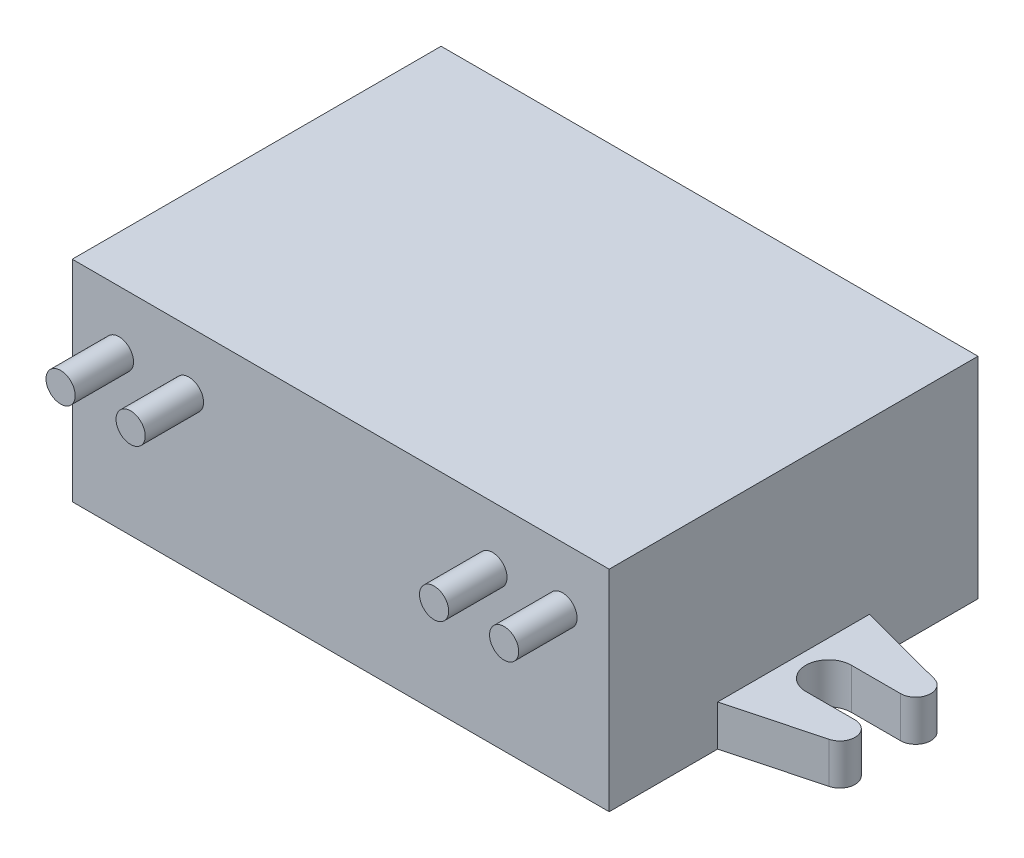
ISO-10303-21;
HEADER;
FILE_DESCRIPTION(('STEP AP214'),'2;1');
FILE_NAME('part.step','',(''),(''),'','','');
FILE_SCHEMA(('AUTOMOTIVE_DESIGN { 1 0 10303 214 1 1 1 1 }'));
ENDSEC;
DATA;
#1=APPLICATION_CONTEXT('core data for automotive mechanical design processes');
#2=APPLICATION_PROTOCOL_DEFINITION('international standard','automotive_design',2000,#1);
#3=PRODUCT_CONTEXT('',#1,'mechanical');
#4=PRODUCT('Part','Part','',(#3));
#5=PRODUCT_RELATED_PRODUCT_CATEGORY('part','',(#4));
#6=PRODUCT_DEFINITION_FORMATION('','',#4);
#7=PRODUCT_DEFINITION_CONTEXT('part definition',#1,'design');
#8=PRODUCT_DEFINITION('design','',#6,#7);
#9=PRODUCT_DEFINITION_SHAPE('','',#8);
#10=(LENGTH_UNIT() NAMED_UNIT(*) SI_UNIT(.MILLI.,.METRE.));
#11=(NAMED_UNIT(*) PLANE_ANGLE_UNIT() SI_UNIT($,.RADIAN.));
#12=(NAMED_UNIT(*) SI_UNIT($,.STERADIAN.) SOLID_ANGLE_UNIT());
#13=UNCERTAINTY_MEASURE_WITH_UNIT(LENGTH_MEASURE(1.E-05),#10,'distance_accuracy_value','');
#14=(GEOMETRIC_REPRESENTATION_CONTEXT(3) GLOBAL_UNCERTAINTY_ASSIGNED_CONTEXT((#13)) GLOBAL_UNIT_ASSIGNED_CONTEXT((#10,
#11,#12)) REPRESENTATION_CONTEXT('',''));
#15=CARTESIAN_POINT('',(0.,0.,0.));
#16=DIRECTION('',(0.,0.,1.));
#17=DIRECTION('',(1.,0.,0.));
#18=AXIS2_PLACEMENT_3D('',#15,#16,#17);
#19=CARTESIAN_POINT('',(-23.,18.,0.));
#20=DIRECTION('',(1.,0.,0.));
#21=DIRECTION('',(0.,0.,-1.));
#22=AXIS2_PLACEMENT_3D('',#19,#20,#21);
#23=PLANE('',#22);
#24=DIRECTION('',(0.,-1.,0.));
#25=VECTOR('',#24,1.);
#26=CARTESIAN_POINT('',(-23.,3.5,-6.49999999999999));
#27=LINE('',#26,#25);
#28=CARTESIAN_POINT('',(-23.,3.5,-6.49999999999999));
#29=VERTEX_POINT('',#28);
#30=CARTESIAN_POINT('',(-23.,0.,-6.49999999999999));
#31=VERTEX_POINT('',#30);
#32=EDGE_CURVE('E262',#29,#31,#27,.T.);
#33=ORIENTED_EDGE('',*,*,#32,.F.);
#34=DIRECTION('',(0.,0.,1.));
#35=VECTOR('',#34,1.);
#36=CARTESIAN_POINT('',(-23.,3.5,0.));
#37=LINE('',#36,#35);
#38=CARTESIAN_POINT('',(-23.,3.5,6.50000000000001));
#39=VERTEX_POINT('',#38);
#40=EDGE_CURVE('E259',#29,#39,#37,.T.);
#41=ORIENTED_EDGE('',*,*,#40,.T.);
#42=DIRECTION('',(0.,-1.,0.));
#43=VECTOR('',#42,1.);
#44=CARTESIAN_POINT('',(-23.,3.5,6.50000000000001));
#45=LINE('',#44,#43);
#46=CARTESIAN_POINT('',(-23.,0.,6.50000000000001));
#47=VERTEX_POINT('',#46);
#48=EDGE_CURVE('E277',#39,#47,#45,.T.);
#49=ORIENTED_EDGE('',*,*,#48,.T.);
#50=DIRECTION('',(0.,0.,1.));
#51=VECTOR('',#50,1.);
#52=CARTESIAN_POINT('',(-23.,0.,0.));
#53=LINE('',#52,#51);
#54=CARTESIAN_POINT('',(-23.,0.,15.8));
#55=VERTEX_POINT('',#54);
#56=EDGE_CURVE('E315',#47,#55,#53,.T.);
#57=ORIENTED_EDGE('',*,*,#56,.T.);
#58=DIRECTION('',(0.,-1.,0.));
#59=VECTOR('',#58,1.);
#60=CARTESIAN_POINT('',(-23.,18.,15.8));
#61=LINE('',#60,#59);
#62=CARTESIAN_POINT('',(-23.,18.,15.8));
#63=VERTEX_POINT('',#62);
#64=EDGE_CURVE('E323',#63,#55,#61,.T.);
#65=ORIENTED_EDGE('',*,*,#64,.F.);
#66=DIRECTION('',(0.,0.,1.));
#67=VECTOR('',#66,1.);
#68=CARTESIAN_POINT('',(-23.,18.,0.));
#69=LINE('',#68,#67);
#70=CARTESIAN_POINT('',(-23.,18.,-15.8));
#71=VERTEX_POINT('',#70);
#72=EDGE_CURVE('E304',#71,#63,#69,.T.);
#73=ORIENTED_EDGE('',*,*,#72,.F.);
#74=DIRECTION('',(0.,-1.,0.));
#75=VECTOR('',#74,1.);
#76=CARTESIAN_POINT('',(-23.,18.,-15.8));
#77=LINE('',#76,#75);
#78=CARTESIAN_POINT('',(-23.,0.,-15.8));
#79=VERTEX_POINT('',#78);
#80=EDGE_CURVE('E326',#71,#79,#77,.T.);
#81=ORIENTED_EDGE('',*,*,#80,.T.);
#82=EDGE_CURVE('E316',#79,#31,#53,.T.);
#83=ORIENTED_EDGE('',*,*,#82,.T.);
#84=EDGE_LOOP('',(#33,#41,#49,#57,#65,#73,#81,#83));
#85=FACE_BOUND('',#84,.T.);
#86=ADVANCED_FACE('F34',(#85),#23,.F.);
#87=CARTESIAN_POINT('',(23.,18.,0.));
#88=DIRECTION('',(1.,0.,0.));
#89=DIRECTION('',(0.,0.,-1.));
#90=AXIS2_PLACEMENT_3D('',#87,#88,#89);
#91=PLANE('',#90);
#92=DIRECTION('',(0.,-1.,0.));
#93=VECTOR('',#92,1.);
#94=CARTESIAN_POINT('',(23.,3.5,6.50000000000001));
#95=LINE('',#94,#93);
#96=CARTESIAN_POINT('',(23.,3.5,6.50000000000001));
#97=VERTEX_POINT('',#96);
#98=CARTESIAN_POINT('',(23.,0.,6.50000000000001));
#99=VERTEX_POINT('',#98);
#100=EDGE_CURVE('E233',#97,#99,#95,.T.);
#101=ORIENTED_EDGE('',*,*,#100,.F.);
#102=DIRECTION('',(0.,0.,1.));
#103=VECTOR('',#102,1.);
#104=CARTESIAN_POINT('',(23.,3.5,0.));
#105=LINE('',#104,#103);
#106=CARTESIAN_POINT('',(23.,3.5,-6.49999999999999));
#107=VERTEX_POINT('',#106);
#108=EDGE_CURVE('E212',#107,#97,#105,.T.);
#109=ORIENTED_EDGE('',*,*,#108,.F.);
#110=DIRECTION('',(0.,-1.,0.));
#111=VECTOR('',#110,1.);
#112=CARTESIAN_POINT('',(23.,3.5,-6.49999999999999));
#113=LINE('',#112,#111);
#114=CARTESIAN_POINT('',(23.,0.,-6.49999999999999));
#115=VERTEX_POINT('',#114);
#116=EDGE_CURVE('E235',#107,#115,#113,.T.);
#117=ORIENTED_EDGE('',*,*,#116,.T.);
#118=DIRECTION('',(0.,0.,1.));
#119=VECTOR('',#118,1.);
#120=CARTESIAN_POINT('',(23.,0.,0.));
#121=LINE('',#120,#119);
#122=CARTESIAN_POINT('',(23.,0.,-15.8));
#123=VERTEX_POINT('',#122);
#124=EDGE_CURVE('E309',#123,#115,#121,.T.);
#125=ORIENTED_EDGE('',*,*,#124,.F.);
#126=DIRECTION('',(0.,-1.,0.));
#127=VECTOR('',#126,1.);
#128=CARTESIAN_POINT('',(23.,18.,-15.8));
#129=LINE('',#128,#127);
#130=CARTESIAN_POINT('',(23.,18.,-15.8));
#131=VERTEX_POINT('',#130);
#132=EDGE_CURVE('E328',#131,#123,#129,.T.);
#133=ORIENTED_EDGE('',*,*,#132,.F.);
#134=DIRECTION('',(0.,0.,1.));
#135=VECTOR('',#134,1.);
#136=CARTESIAN_POINT('',(23.,18.,0.));
#137=LINE('',#136,#135);
#138=CARTESIAN_POINT('',(23.,18.,15.8));
#139=VERTEX_POINT('',#138);
#140=EDGE_CURVE('E297',#131,#139,#137,.T.);
#141=ORIENTED_EDGE('',*,*,#140,.T.);
#142=DIRECTION('',(0.,-1.,0.));
#143=VECTOR('',#142,1.);
#144=CARTESIAN_POINT('',(23.,18.,15.8));
#145=LINE('',#144,#143);
#146=CARTESIAN_POINT('',(23.,0.,15.8));
#147=VERTEX_POINT('',#146);
#148=EDGE_CURVE('E308',#139,#147,#145,.T.);
#149=ORIENTED_EDGE('',*,*,#148,.T.);
#150=EDGE_CURVE('E296',#99,#147,#121,.T.);
#151=ORIENTED_EDGE('',*,*,#150,.F.);
#152=EDGE_LOOP('',(#101,#109,#117,#125,#133,#141,#149,#151));
#153=FACE_BOUND('',#152,.T.);
#154=ADVANCED_FACE('F36',(#153),#91,.T.);
#155=CARTESIAN_POINT('',(0.,18.,-15.8));
#156=DIRECTION('',(0.,0.,-1.));
#157=DIRECTION('',(-1.,0.,0.));
#158=AXIS2_PLACEMENT_3D('',#155,#156,#157);
#159=PLANE('',#158);
#160=DIRECTION('',(1.,0.,0.));
#161=VECTOR('',#160,1.);
#162=CARTESIAN_POINT('',(0.,0.,-15.8));
#163=LINE('',#162,#161);
#164=EDGE_CURVE('E312',#79,#123,#163,.T.);
#165=ORIENTED_EDGE('',*,*,#164,.F.);
#166=ORIENTED_EDGE('',*,*,#80,.F.);
#167=DIRECTION('',(1.,0.,0.));
#168=VECTOR('',#167,1.);
#169=CARTESIAN_POINT('',(0.,18.,-15.8));
#170=LINE('',#169,#168);
#171=EDGE_CURVE('E300',#71,#131,#170,.T.);
#172=ORIENTED_EDGE('',*,*,#171,.T.);
#173=ORIENTED_EDGE('',*,*,#132,.T.);
#174=EDGE_LOOP('',(#165,#166,#172,#173));
#175=FACE_BOUND('',#174,.T.);
#176=ADVANCED_FACE('F344',(#175),#159,.T.);
#177=CARTESIAN_POINT('',(0.,18.,15.8));
#178=DIRECTION('',(0.,0.,-1.));
#179=DIRECTION('',(-1.,0.,0.));
#180=AXIS2_PLACEMENT_3D('',#177,#178,#179);
#181=PLANE('',#180);
#182=CARTESIAN_POINT('',(-13.,13.,15.8));
#183=DIRECTION('',(0.,0.,-1.));
#184=DIRECTION('',(-1.,0.,0.));
#185=AXIS2_PLACEMENT_3D('',#182,#183,#184);
#186=CIRCLE('',#185,1.25);
#187=CARTESIAN_POINT('',(-14.25,13.,15.8));
#188=VERTEX_POINT('',#187);
#189=EDGE_CURVE('E11',#188,#188,#186,.F.);
#190=ORIENTED_EDGE('',*,*,#189,.F.);
#191=EDGE_LOOP('',(#190));
#192=FACE_BOUND('',#191,.T.);
#193=CARTESIAN_POINT('',(-19.,13.,15.8));
#194=DIRECTION('',(0.,0.,-1.));
#195=DIRECTION('',(-1.,0.,0.));
#196=AXIS2_PLACEMENT_3D('',#193,#194,#195);
#197=CIRCLE('',#196,1.25);
#198=CARTESIAN_POINT('',(-20.25,13.,15.8));
#199=VERTEX_POINT('',#198);
#200=EDGE_CURVE('E42',#199,#199,#197,.F.);
#201=ORIENTED_EDGE('',*,*,#200,.F.);
#202=EDGE_LOOP('',(#201));
#203=FACE_BOUND('',#202,.T.);
#204=CARTESIAN_POINT('',(13.,13.,15.8));
#205=DIRECTION('',(0.,0.,-1.));
#206=DIRECTION('',(-1.,0.,0.));
#207=AXIS2_PLACEMENT_3D('',#204,#205,#206);
#208=CIRCLE('',#207,1.25);
#209=CARTESIAN_POINT('',(11.75,13.,15.8));
#210=VERTEX_POINT('',#209);
#211=EDGE_CURVE('E333',#210,#210,#208,.F.);
#212=ORIENTED_EDGE('',*,*,#211,.F.);
#213=EDGE_LOOP('',(#212));
#214=FACE_BOUND('',#213,.T.);
#215=CARTESIAN_POINT('',(19.,13.,15.8));
#216=DIRECTION('',(0.,0.,-1.));
#217=DIRECTION('',(-1.,0.,0.));
#218=AXIS2_PLACEMENT_3D('',#215,#216,#217);
#219=CIRCLE('',#218,1.25);
#220=CARTESIAN_POINT('',(17.75,13.,15.8));
#221=VERTEX_POINT('',#220);
#222=EDGE_CURVE('E330',#221,#221,#219,.F.);
#223=ORIENTED_EDGE('',*,*,#222,.F.);
#224=EDGE_LOOP('',(#223));
#225=FACE_BOUND('',#224,.T.);
#226=DIRECTION('',(1.,0.,0.));
#227=VECTOR('',#226,1.);
#228=CARTESIAN_POINT('',(0.,0.,15.8));
#229=LINE('',#228,#227);
#230=EDGE_CURVE('E301',#55,#147,#229,.T.);
#231=ORIENTED_EDGE('',*,*,#230,.T.);
#232=ORIENTED_EDGE('',*,*,#148,.F.);
#233=DIRECTION('',(1.,0.,0.));
#234=VECTOR('',#233,1.);
#235=CARTESIAN_POINT('',(0.,18.,15.8));
#236=LINE('',#235,#234);
#237=EDGE_CURVE('E306',#63,#139,#236,.T.);
#238=ORIENTED_EDGE('',*,*,#237,.F.);
#239=ORIENTED_EDGE('',*,*,#64,.T.);
#240=EDGE_LOOP('',(#231,#232,#238,#239));
#241=FACE_BOUND('',#240,.T.);
#242=ADVANCED_FACE('F340',(#192,#203,#214,#225,#241),#181,.F.);
#243=CARTESIAN_POINT('',(0.,18.,0.));
#244=DIRECTION('',(0.,1.,0.));
#245=DIRECTION('',(0.,0.,1.));
#246=AXIS2_PLACEMENT_3D('',#243,#244,#245);
#247=PLANE('',#246);
#248=ORIENTED_EDGE('',*,*,#140,.F.);
#249=ORIENTED_EDGE('',*,*,#171,.F.);
#250=ORIENTED_EDGE('',*,*,#72,.T.);
#251=ORIENTED_EDGE('',*,*,#237,.T.);
#252=EDGE_LOOP('',(#248,#249,#250,#251));
#253=FACE_BOUND('',#252,.T.);
#254=ADVANCED_FACE('F343',(#253),#247,.T.);
#255=CARTESIAN_POINT('',(0.,0.,0.));
#256=DIRECTION('',(0.,1.,0.));
#257=DIRECTION('',(0.,0.,1.));
#258=AXIS2_PLACEMENT_3D('',#255,#256,#257);
#259=PLANE('',#258);
#260=ORIENTED_EDGE('',*,*,#124,.T.);
#261=DIRECTION('',(0.966628418373112,0.,0.256182553647777));
#262=VECTOR('',#261,1.);
#263=CARTESIAN_POINT('',(3.11909520645809,0.,-11.768974987731));
#264=LINE('',#263,#262);
#265=CARTESIAN_POINT('',(30.546403177026,0.,-4.50000000000001));
#266=VERTEX_POINT('',#265);
#267=EDGE_CURVE('E49',#115,#266,#264,.T.);
#268=ORIENTED_EDGE('',*,*,#267,.T.);
#269=CARTESIAN_POINT('',(30.2142278124788,0.,-3.24663538682589));
#270=DIRECTION('',(0.,1.,0.));
#271=DIRECTION('',(0.,0.,1.));
#272=AXIS2_PLACEMENT_3D('',#269,#270,#271);
#273=CIRCLE('',#272,1.29663538682589);
#274=CARTESIAN_POINT('',(30.2142278124788,0.,-1.95000000000001));
#275=VERTEX_POINT('',#274);
#276=EDGE_CURVE('E226',#266,#275,#273,.F.);
#277=ORIENTED_EDGE('',*,*,#276,.T.);
#278=DIRECTION('',(-1.,0.,0.));
#279=VECTOR('',#278,1.);
#280=CARTESIAN_POINT('',(0.,0.,-1.95));
#281=LINE('',#280,#279);
#282=CARTESIAN_POINT('',(26.,0.,-1.95000000000001));
#283=VERTEX_POINT('',#282);
#284=EDGE_CURVE('E223',#275,#283,#281,.T.);
#285=ORIENTED_EDGE('',*,*,#284,.T.);
#286=CARTESIAN_POINT('',(26.,0.,0.));
#287=DIRECTION('',(0.,1.,0.));
#288=DIRECTION('',(0.,0.,1.));
#289=AXIS2_PLACEMENT_3D('',#286,#287,#288);
#290=CIRCLE('',#289,1.95);
#291=CARTESIAN_POINT('',(26.,0.,1.94999999999999));
#292=VERTEX_POINT('',#291);
#293=EDGE_CURVE('E220',#283,#292,#290,.T.);
#294=ORIENTED_EDGE('',*,*,#293,.T.);
#295=DIRECTION('',(1.,0.,0.));
#296=VECTOR('',#295,1.);
#297=CARTESIAN_POINT('',(0.,0.,1.95));
#298=LINE('',#297,#296);
#299=CARTESIAN_POINT('',(30.2142278124788,0.,1.94999999999999));
#300=VERTEX_POINT('',#299);
#301=EDGE_CURVE('E217',#292,#300,#298,.T.);
#302=ORIENTED_EDGE('',*,*,#301,.T.);
#303=CARTESIAN_POINT('',(30.2142278124788,0.,3.24663538682588));
#304=DIRECTION('',(0.,1.,0.));
#305=DIRECTION('',(0.,0.,1.));
#306=AXIS2_PLACEMENT_3D('',#303,#304,#305);
#307=CIRCLE('',#306,1.29663538682589);
#308=CARTESIAN_POINT('',(30.546403177026,0.,4.49999999999999));
#309=VERTEX_POINT('',#308);
#310=EDGE_CURVE('E179',#300,#309,#307,.F.);
#311=ORIENTED_EDGE('',*,*,#310,.T.);
#312=DIRECTION('',(-0.966628418373111,0.,0.256182553647781));
#313=VECTOR('',#312,1.);
#314=CARTESIAN_POINT('',(3.11909520645817,0.,11.7689749877311));
#315=LINE('',#314,#313);
#316=EDGE_CURVE('E195',#309,#99,#315,.T.);
#317=ORIENTED_EDGE('',*,*,#316,.T.);
#318=ORIENTED_EDGE('',*,*,#150,.T.);
#319=ORIENTED_EDGE('',*,*,#230,.F.);
#320=ORIENTED_EDGE('',*,*,#56,.F.);
#321=DIRECTION('',(0.966628418373111,0.,0.256182553647781));
#322=VECTOR('',#321,1.);
#323=CARTESIAN_POINT('',(-3.11909520645817,0.,11.7689749877311));
#324=LINE('',#323,#322);
#325=CARTESIAN_POINT('',(-30.546403177026,0.,4.5));
#326=VERTEX_POINT('',#325);
#327=EDGE_CURVE('E57',#326,#47,#324,.T.);
#328=ORIENTED_EDGE('',*,*,#327,.F.);
#329=CARTESIAN_POINT('',(-30.2142278124788,0.,3.24663538682589));
#330=DIRECTION('',(0.,1.,0.));
#331=DIRECTION('',(0.,0.,1.));
#332=AXIS2_PLACEMENT_3D('',#329,#330,#331);
#333=CIRCLE('',#332,1.29663538682589);
#334=CARTESIAN_POINT('',(-30.2142278124788,0.,1.95));
#335=VERTEX_POINT('',#334);
#336=EDGE_CURVE('E273',#335,#326,#333,.T.);
#337=ORIENTED_EDGE('',*,*,#336,.F.);
#338=DIRECTION('',(-1.,0.,0.));
#339=VECTOR('',#338,1.);
#340=CARTESIAN_POINT('',(0.,0.,1.95));
#341=LINE('',#340,#339);
#342=CARTESIAN_POINT('',(-26.,0.,1.95));
#343=VERTEX_POINT('',#342);
#344=EDGE_CURVE('E271',#343,#335,#341,.T.);
#345=ORIENTED_EDGE('',*,*,#344,.F.);
#346=CARTESIAN_POINT('',(-26.,0.,0.));
#347=DIRECTION('',(0.,1.,0.));
#348=DIRECTION('',(0.,0.,1.));
#349=AXIS2_PLACEMENT_3D('',#346,#347,#348);
#350=CIRCLE('',#349,1.95);
#351=CARTESIAN_POINT('',(-26.,0.,-1.95));
#352=VERTEX_POINT('',#351);
#353=EDGE_CURVE('E269',#352,#343,#350,.F.);
#354=ORIENTED_EDGE('',*,*,#353,.F.);
#355=DIRECTION('',(1.,0.,0.));
#356=VECTOR('',#355,1.);
#357=CARTESIAN_POINT('',(0.,0.,-1.95));
#358=LINE('',#357,#356);
#359=CARTESIAN_POINT('',(-30.2142278124788,0.,-1.95));
#360=VERTEX_POINT('',#359);
#361=EDGE_CURVE('E267',#360,#352,#358,.T.);
#362=ORIENTED_EDGE('',*,*,#361,.F.);
#363=CARTESIAN_POINT('',(-30.2142278124788,0.,-3.24663538682589));
#364=DIRECTION('',(0.,1.,0.));
#365=DIRECTION('',(0.,0.,1.));
#366=AXIS2_PLACEMENT_3D('',#363,#364,#365);
#367=CIRCLE('',#366,1.29663538682589);
#368=CARTESIAN_POINT('',(-30.546403177026,0.,-4.5));
#369=VERTEX_POINT('',#368);
#370=EDGE_CURVE('E265',#369,#360,#367,.T.);
#371=ORIENTED_EDGE('',*,*,#370,.F.);
#372=DIRECTION('',(-0.966628418373112,0.,0.256182553647778));
#373=VECTOR('',#372,1.);
#374=CARTESIAN_POINT('',(-3.1190952064581,0.,-11.768974987731));
#375=LINE('',#374,#373);
#376=EDGE_CURVE('E184',#31,#369,#375,.T.);
#377=ORIENTED_EDGE('',*,*,#376,.F.);
#378=ORIENTED_EDGE('',*,*,#82,.F.);
#379=ORIENTED_EDGE('',*,*,#164,.T.);
#380=EDGE_LOOP('',(#260,#268,#277,#285,#294,#302,#311,#317,#318,#319,#320,#328,#337,#345,#354,
#362,#371,#377,#378,#379));
#381=FACE_BOUND('',#380,.T.);
#382=ADVANCED_FACE('F357',(#381),#259,.F.);
#383=CARTESIAN_POINT('',(-3.1190952064581,3.5,-11.768974987731));
#384=DIRECTION('',(0.256182553647778,0.,0.966628418373112));
#385=DIRECTION('',(0.966628418373112,0.,-0.256182553647778));
#386=AXIS2_PLACEMENT_3D('',#383,#384,#385);
#387=PLANE('',#386);
#388=ORIENTED_EDGE('',*,*,#376,.T.);
#389=DIRECTION('',(0.,-1.,0.));
#390=VECTOR('',#389,1.);
#391=CARTESIAN_POINT('',(-30.546403177026,3.5,-4.5));
#392=LINE('',#391,#390);
#393=CARTESIAN_POINT('',(-30.546403177026,3.5,-4.5));
#394=VERTEX_POINT('',#393);
#395=EDGE_CURVE('E293',#394,#369,#392,.T.);
#396=ORIENTED_EDGE('',*,*,#395,.F.);
#397=DIRECTION('',(-0.966628418373112,0.,0.256182553647778));
#398=VECTOR('',#397,1.);
#399=CARTESIAN_POINT('',(-3.1190952064581,3.5,-11.768974987731));
#400=LINE('',#399,#398);
#401=EDGE_CURVE('E244',#29,#394,#400,.T.);
#402=ORIENTED_EDGE('',*,*,#401,.F.);
#403=ORIENTED_EDGE('',*,*,#32,.T.);
#404=EDGE_LOOP('',(#388,#396,#402,#403));
#405=FACE_BOUND('',#404,.T.);
#406=ADVANCED_FACE('F403',(#405),#387,.F.);
#407=CARTESIAN_POINT('',(-30.2142278124788,3.5,-3.24663538682589));
#408=DIRECTION('',(0.,-1.,0.));
#409=DIRECTION('',(0.,0.,-1.));
#410=AXIS2_PLACEMENT_3D('',#407,#408,#409);
#411=CYLINDRICAL_SURFACE('',#410,1.29663538682589);
#412=ORIENTED_EDGE('',*,*,#370,.T.);
#413=DIRECTION('',(0.,-1.,0.));
#414=VECTOR('',#413,1.);
#415=CARTESIAN_POINT('',(-30.2142278124788,3.5,-1.95));
#416=LINE('',#415,#414);
#417=CARTESIAN_POINT('',(-30.2142278124788,3.5,-1.95));
#418=VERTEX_POINT('',#417);
#419=EDGE_CURVE('E290',#418,#360,#416,.T.);
#420=ORIENTED_EDGE('',*,*,#419,.F.);
#421=CARTESIAN_POINT('',(-30.2142278124788,3.5,-3.24663538682589));
#422=DIRECTION('',(0.,1.,0.));
#423=DIRECTION('',(0.,0.,1.));
#424=AXIS2_PLACEMENT_3D('',#421,#422,#423);
#425=CIRCLE('',#424,1.29663538682589);
#426=EDGE_CURVE('E247',#394,#418,#425,.T.);
#427=ORIENTED_EDGE('',*,*,#426,.F.);
#428=ORIENTED_EDGE('',*,*,#395,.T.);
#429=EDGE_LOOP('',(#412,#420,#427,#428));
#430=FACE_BOUND('',#429,.T.);
#431=ADVANCED_FACE('F401',(#430),#411,.T.);
#432=CARTESIAN_POINT('',(0.,3.5,-1.95));
#433=DIRECTION('',(0.,0.,-1.));
#434=DIRECTION('',(-1.,0.,0.));
#435=AXIS2_PLACEMENT_3D('',#432,#433,#434);
#436=PLANE('',#435);
#437=ORIENTED_EDGE('',*,*,#361,.T.);
#438=DIRECTION('',(0.,-1.,0.));
#439=VECTOR('',#438,1.);
#440=CARTESIAN_POINT('',(-26.,3.5,-1.95));
#441=LINE('',#440,#439);
#442=CARTESIAN_POINT('',(-26.,3.5,-1.95));
#443=VERTEX_POINT('',#442);
#444=EDGE_CURVE('E287',#443,#352,#441,.T.);
#445=ORIENTED_EDGE('',*,*,#444,.F.);
#446=DIRECTION('',(1.,0.,0.));
#447=VECTOR('',#446,1.);
#448=CARTESIAN_POINT('',(0.,3.5,-1.95));
#449=LINE('',#448,#447);
#450=EDGE_CURVE('E249',#418,#443,#449,.T.);
#451=ORIENTED_EDGE('',*,*,#450,.F.);
#452=ORIENTED_EDGE('',*,*,#419,.T.);
#453=EDGE_LOOP('',(#437,#445,#451,#452));
#454=FACE_BOUND('',#453,.T.);
#455=ADVANCED_FACE('F396',(#454),#436,.F.);
#456=CARTESIAN_POINT('',(-26.,3.5,0.));
#457=DIRECTION('',(0.,-1.,0.));
#458=DIRECTION('',(0.,0.,-1.));
#459=AXIS2_PLACEMENT_3D('',#456,#457,#458);
#460=CYLINDRICAL_SURFACE('',#459,1.95);
#461=ORIENTED_EDGE('',*,*,#353,.T.);
#462=DIRECTION('',(0.,-1.,0.));
#463=VECTOR('',#462,1.);
#464=CARTESIAN_POINT('',(-26.,3.5,1.95));
#465=LINE('',#464,#463);
#466=CARTESIAN_POINT('',(-26.,3.5,1.95));
#467=VERTEX_POINT('',#466);
#468=EDGE_CURVE('E284',#467,#343,#465,.T.);
#469=ORIENTED_EDGE('',*,*,#468,.F.);
#470=CARTESIAN_POINT('',(-26.,3.5,0.));
#471=DIRECTION('',(0.,1.,0.));
#472=DIRECTION('',(0.,0.,1.));
#473=AXIS2_PLACEMENT_3D('',#470,#471,#472);
#474=CIRCLE('',#473,1.95);
#475=EDGE_CURVE('E251',#443,#467,#474,.F.);
#476=ORIENTED_EDGE('',*,*,#475,.F.);
#477=ORIENTED_EDGE('',*,*,#444,.T.);
#478=EDGE_LOOP('',(#461,#469,#476,#477));
#479=FACE_BOUND('',#478,.T.);
#480=ADVANCED_FACE('F392',(#479),#460,.F.);
#481=CARTESIAN_POINT('',(0.,3.5,1.95));
#482=DIRECTION('',(0.,0.,1.));
#483=DIRECTION('',(1.,0.,0.));
#484=AXIS2_PLACEMENT_3D('',#481,#482,#483);
#485=PLANE('',#484);
#486=ORIENTED_EDGE('',*,*,#344,.T.);
#487=DIRECTION('',(0.,-1.,0.));
#488=VECTOR('',#487,1.);
#489=CARTESIAN_POINT('',(-30.2142278124788,3.5,1.95));
#490=LINE('',#489,#488);
#491=CARTESIAN_POINT('',(-30.2142278124788,3.5,1.95));
#492=VERTEX_POINT('',#491);
#493=EDGE_CURVE('E281',#492,#335,#490,.T.);
#494=ORIENTED_EDGE('',*,*,#493,.F.);
#495=DIRECTION('',(-1.,0.,0.));
#496=VECTOR('',#495,1.);
#497=CARTESIAN_POINT('',(0.,3.5,1.95));
#498=LINE('',#497,#496);
#499=EDGE_CURVE('E253',#467,#492,#498,.T.);
#500=ORIENTED_EDGE('',*,*,#499,.F.);
#501=ORIENTED_EDGE('',*,*,#468,.T.);
#502=EDGE_LOOP('',(#486,#494,#500,#501));
#503=FACE_BOUND('',#502,.T.);
#504=ADVANCED_FACE('F388',(#503),#485,.F.);
#505=CARTESIAN_POINT('',(-30.2142278124788,3.5,3.24663538682589));
#506=DIRECTION('',(0.,-1.,0.));
#507=DIRECTION('',(0.,0.,-1.));
#508=AXIS2_PLACEMENT_3D('',#505,#506,#507);
#509=CYLINDRICAL_SURFACE('',#508,1.29663538682589);
#510=ORIENTED_EDGE('',*,*,#336,.T.);
#511=DIRECTION('',(0.,-1.,0.));
#512=VECTOR('',#511,1.);
#513=CARTESIAN_POINT('',(-30.546403177026,3.5,4.5));
#514=LINE('',#513,#512);
#515=CARTESIAN_POINT('',(-30.546403177026,3.5,4.5));
#516=VERTEX_POINT('',#515);
#517=EDGE_CURVE('E279',#516,#326,#514,.T.);
#518=ORIENTED_EDGE('',*,*,#517,.F.);
#519=CARTESIAN_POINT('',(-30.2142278124788,3.5,3.24663538682589));
#520=DIRECTION('',(0.,1.,0.));
#521=DIRECTION('',(0.,0.,1.));
#522=AXIS2_PLACEMENT_3D('',#519,#520,#521);
#523=CIRCLE('',#522,1.29663538682589);
#524=EDGE_CURVE('E255',#492,#516,#523,.T.);
#525=ORIENTED_EDGE('',*,*,#524,.F.);
#526=ORIENTED_EDGE('',*,*,#493,.T.);
#527=EDGE_LOOP('',(#510,#518,#525,#526));
#528=FACE_BOUND('',#527,.T.);
#529=ADVANCED_FACE('F382',(#528),#509,.T.);
#530=CARTESIAN_POINT('',(-3.11909520645817,3.5,11.7689749877311));
#531=DIRECTION('',(0.256182553647781,0.,-0.966628418373111));
#532=DIRECTION('',(-0.966628418373111,0.,-0.256182553647781));
#533=AXIS2_PLACEMENT_3D('',#530,#531,#532);
#534=PLANE('',#533);
#535=ORIENTED_EDGE('',*,*,#327,.T.);
#536=ORIENTED_EDGE('',*,*,#48,.F.);
#537=DIRECTION('',(0.966628418373111,0.,0.256182553647781));
#538=VECTOR('',#537,1.);
#539=CARTESIAN_POINT('',(-3.11909520645817,3.5,11.7689749877311));
#540=LINE('',#539,#538);
#541=EDGE_CURVE('E257',#516,#39,#540,.T.);
#542=ORIENTED_EDGE('',*,*,#541,.F.);
#543=ORIENTED_EDGE('',*,*,#517,.T.);
#544=EDGE_LOOP('',(#535,#536,#542,#543));
#545=FACE_BOUND('',#544,.T.);
#546=ADVANCED_FACE('F374',(#545),#534,.F.);
#547=CARTESIAN_POINT('',(0.,3.5,0.));
#548=DIRECTION('',(0.,1.,0.));
#549=DIRECTION('',(0.,0.,1.));
#550=AXIS2_PLACEMENT_3D('',#547,#548,#549);
#551=PLANE('',#550);
#552=ORIENTED_EDGE('',*,*,#401,.T.);
#553=ORIENTED_EDGE('',*,*,#426,.T.);
#554=ORIENTED_EDGE('',*,*,#450,.T.);
#555=ORIENTED_EDGE('',*,*,#475,.T.);
#556=ORIENTED_EDGE('',*,*,#499,.T.);
#557=ORIENTED_EDGE('',*,*,#524,.T.);
#558=ORIENTED_EDGE('',*,*,#541,.T.);
#559=ORIENTED_EDGE('',*,*,#40,.F.);
#560=EDGE_LOOP('',(#552,#553,#554,#555,#556,#557,#558,#559));
#561=FACE_BOUND('',#560,.T.);
#562=ADVANCED_FACE('F377',(#561),#551,.T.);
#563=CARTESIAN_POINT('',(30.2142278124788,3.5,3.24663538682588));
#564=DIRECTION('',(0.,-1.,0.));
#565=DIRECTION('',(0.,0.,-1.));
#566=AXIS2_PLACEMENT_3D('',#563,#564,#565);
#567=CYLINDRICAL_SURFACE('',#566,1.29663538682589);
#568=ORIENTED_EDGE('',*,*,#310,.F.);
#569=DIRECTION('',(0.,-1.,0.));
#570=VECTOR('',#569,1.);
#571=CARTESIAN_POINT('',(30.2142278124788,3.5,1.94999999999999));
#572=LINE('',#571,#570);
#573=CARTESIAN_POINT('',(30.2142278124788,3.5,1.94999999999999));
#574=VERTEX_POINT('',#573);
#575=EDGE_CURVE('E173',#574,#300,#572,.T.);
#576=ORIENTED_EDGE('',*,*,#575,.F.);
#577=CARTESIAN_POINT('',(30.2142278124788,3.5,3.24663538682588));
#578=DIRECTION('',(0.,1.,0.));
#579=DIRECTION('',(0.,0.,1.));
#580=AXIS2_PLACEMENT_3D('',#577,#578,#579);
#581=CIRCLE('',#580,1.29663538682589);
#582=CARTESIAN_POINT('',(30.546403177026,3.5,4.49999999999999));
#583=VERTEX_POINT('',#582);
#584=EDGE_CURVE('E176',#574,#583,#581,.F.);
#585=ORIENTED_EDGE('',*,*,#584,.T.);
#586=DIRECTION('',(0.,-1.,0.));
#587=VECTOR('',#586,1.);
#588=CARTESIAN_POINT('',(30.546403177026,3.5,4.49999999999999));
#589=LINE('',#588,#587);
#590=EDGE_CURVE('E215',#583,#309,#589,.T.);
#591=ORIENTED_EDGE('',*,*,#590,.T.);
#592=EDGE_LOOP('',(#568,#576,#585,#591));
#593=FACE_BOUND('',#592,.T.);
#594=ADVANCED_FACE('F175',(#593),#567,.T.);
#595=CARTESIAN_POINT('',(0.,3.5,1.95));
#596=DIRECTION('',(0.,0.,-1.));
#597=DIRECTION('',(-1.,0.,0.));
#598=AXIS2_PLACEMENT_3D('',#595,#596,#597);
#599=PLANE('',#598);
#600=ORIENTED_EDGE('',*,*,#301,.F.);
#601=DIRECTION('',(0.,-1.,0.));
#602=VECTOR('',#601,1.);
#603=CARTESIAN_POINT('',(26.,3.5,1.94999999999999));
#604=LINE('',#603,#602);
#605=CARTESIAN_POINT('',(26.,3.5,1.94999999999999));
#606=VERTEX_POINT('',#605);
#607=EDGE_CURVE('E185',#606,#292,#604,.T.);
#608=ORIENTED_EDGE('',*,*,#607,.F.);
#609=DIRECTION('',(1.,0.,0.));
#610=VECTOR('',#609,1.);
#611=CARTESIAN_POINT('',(0.,3.5,1.95));
#612=LINE('',#611,#610);
#613=EDGE_CURVE('E191',#606,#574,#612,.T.);
#614=ORIENTED_EDGE('',*,*,#613,.T.);
#615=ORIENTED_EDGE('',*,*,#575,.T.);
#616=EDGE_LOOP('',(#600,#608,#614,#615));
#617=FACE_BOUND('',#616,.T.);
#618=ADVANCED_FACE('F197',(#617),#599,.T.);
#619=CARTESIAN_POINT('',(26.,3.5,0.));
#620=DIRECTION('',(0.,-1.,0.));
#621=DIRECTION('',(0.,0.,-1.));
#622=AXIS2_PLACEMENT_3D('',#619,#620,#621);
#623=CYLINDRICAL_SURFACE('',#622,1.95);
#624=ORIENTED_EDGE('',*,*,#293,.F.);
#625=DIRECTION('',(0.,-1.,0.));
#626=VECTOR('',#625,1.);
#627=CARTESIAN_POINT('',(26.,3.5,-1.95000000000001));
#628=LINE('',#627,#626);
#629=CARTESIAN_POINT('',(26.,3.5,-1.95000000000001));
#630=VERTEX_POINT('',#629);
#631=EDGE_CURVE('E241',#630,#283,#628,.T.);
#632=ORIENTED_EDGE('',*,*,#631,.F.);
#633=CARTESIAN_POINT('',(26.,3.5,0.));
#634=DIRECTION('',(0.,1.,0.));
#635=DIRECTION('',(0.,0.,1.));
#636=AXIS2_PLACEMENT_3D('',#633,#634,#635);
#637=CIRCLE('',#636,1.95);
#638=EDGE_CURVE('E198',#630,#606,#637,.T.);
#639=ORIENTED_EDGE('',*,*,#638,.T.);
#640=ORIENTED_EDGE('',*,*,#607,.T.);
#641=EDGE_LOOP('',(#624,#632,#639,#640));
#642=FACE_BOUND('',#641,.T.);
#643=ADVANCED_FACE('F417',(#642),#623,.F.);
#644=CARTESIAN_POINT('',(0.,3.5,-1.95));
#645=DIRECTION('',(0.,0.,1.));
#646=DIRECTION('',(1.,0.,0.));
#647=AXIS2_PLACEMENT_3D('',#644,#645,#646);
#648=PLANE('',#647);
#649=ORIENTED_EDGE('',*,*,#284,.F.);
#650=DIRECTION('',(0.,-1.,0.));
#651=VECTOR('',#650,1.);
#652=CARTESIAN_POINT('',(30.2142278124788,3.5,-1.95000000000001));
#653=LINE('',#652,#651);
#654=CARTESIAN_POINT('',(30.2142278124788,3.5,-1.95000000000001));
#655=VERTEX_POINT('',#654);
#656=EDGE_CURVE('E239',#655,#275,#653,.T.);
#657=ORIENTED_EDGE('',*,*,#656,.F.);
#658=DIRECTION('',(-1.,0.,0.));
#659=VECTOR('',#658,1.);
#660=CARTESIAN_POINT('',(0.,3.5,-1.95));
#661=LINE('',#660,#659);
#662=EDGE_CURVE('E200',#655,#630,#661,.T.);
#663=ORIENTED_EDGE('',*,*,#662,.T.);
#664=ORIENTED_EDGE('',*,*,#631,.T.);
#665=EDGE_LOOP('',(#649,#657,#663,#664));
#666=FACE_BOUND('',#665,.T.);
#667=ADVANCED_FACE('F415',(#666),#648,.T.);
#668=CARTESIAN_POINT('',(30.2142278124788,3.5,-3.24663538682589));
#669=DIRECTION('',(0.,-1.,0.));
#670=DIRECTION('',(0.,0.,-1.));
#671=AXIS2_PLACEMENT_3D('',#668,#669,#670);
#672=CYLINDRICAL_SURFACE('',#671,1.29663538682589);
#673=ORIENTED_EDGE('',*,*,#276,.F.);
#674=DIRECTION('',(0.,-1.,0.));
#675=VECTOR('',#674,1.);
#676=CARTESIAN_POINT('',(30.546403177026,3.5,-4.50000000000001));
#677=LINE('',#676,#675);
#678=CARTESIAN_POINT('',(30.546403177026,3.5,-4.50000000000001));
#679=VERTEX_POINT('',#678);
#680=EDGE_CURVE('E237',#679,#266,#677,.T.);
#681=ORIENTED_EDGE('',*,*,#680,.F.);
#682=CARTESIAN_POINT('',(30.2142278124788,3.5,-3.24663538682589));
#683=DIRECTION('',(0.,1.,0.));
#684=DIRECTION('',(0.,0.,1.));
#685=AXIS2_PLACEMENT_3D('',#682,#683,#684);
#686=CIRCLE('',#685,1.29663538682589);
#687=EDGE_CURVE('E206',#679,#655,#686,.F.);
#688=ORIENTED_EDGE('',*,*,#687,.T.);
#689=ORIENTED_EDGE('',*,*,#656,.T.);
#690=EDGE_LOOP('',(#673,#681,#688,#689));
#691=FACE_BOUND('',#690,.T.);
#692=ADVANCED_FACE('F411',(#691),#672,.T.);
#693=CARTESIAN_POINT('',(3.11909520645809,3.5,-11.768974987731));
#694=DIRECTION('',(0.256182553647777,0.,-0.966628418373112));
#695=DIRECTION('',(-0.966628418373112,0.,-0.256182553647777));
#696=AXIS2_PLACEMENT_3D('',#693,#694,#695);
#697=PLANE('',#696);
#698=ORIENTED_EDGE('',*,*,#267,.F.);
#699=ORIENTED_EDGE('',*,*,#116,.F.);
#700=DIRECTION('',(0.966628418373112,0.,0.256182553647777));
#701=VECTOR('',#700,1.);
#702=CARTESIAN_POINT('',(3.11909520645809,3.5,-11.768974987731));
#703=LINE('',#702,#701);
#704=EDGE_CURVE('E209',#107,#679,#703,.T.);
#705=ORIENTED_EDGE('',*,*,#704,.T.);
#706=ORIENTED_EDGE('',*,*,#680,.T.);
#707=EDGE_LOOP('',(#698,#699,#705,#706));
#708=FACE_BOUND('',#707,.T.);
#709=ADVANCED_FACE('F406',(#708),#697,.T.);
#710=CARTESIAN_POINT('',(3.11909520645817,3.5,11.7689749877311));
#711=DIRECTION('',(0.256182553647781,0.,0.966628418373111));
#712=DIRECTION('',(0.966628418373111,0.,-0.256182553647781));
#713=AXIS2_PLACEMENT_3D('',#710,#711,#712);
#714=PLANE('',#713);
#715=ORIENTED_EDGE('',*,*,#316,.F.);
#716=ORIENTED_EDGE('',*,*,#590,.F.);
#717=DIRECTION('',(-0.966628418373111,0.,0.256182553647781));
#718=VECTOR('',#717,1.);
#719=CARTESIAN_POINT('',(3.11909520645817,3.5,11.7689749877311));
#720=LINE('',#719,#718);
#721=EDGE_CURVE('E194',#583,#97,#720,.T.);
#722=ORIENTED_EDGE('',*,*,#721,.T.);
#723=ORIENTED_EDGE('',*,*,#100,.T.);
#724=EDGE_LOOP('',(#715,#716,#722,#723));
#725=FACE_BOUND('',#724,.T.);
#726=ADVANCED_FACE('F419',(#725),#714,.T.);
#727=CARTESIAN_POINT('',(0.,3.5,0.));
#728=DIRECTION('',(0.,1.,0.));
#729=DIRECTION('',(0.,0.,1.));
#730=AXIS2_PLACEMENT_3D('',#727,#728,#729);
#731=PLANE('',#730);
#732=ORIENTED_EDGE('',*,*,#584,.F.);
#733=ORIENTED_EDGE('',*,*,#613,.F.);
#734=ORIENTED_EDGE('',*,*,#638,.F.);
#735=ORIENTED_EDGE('',*,*,#662,.F.);
#736=ORIENTED_EDGE('',*,*,#687,.F.);
#737=ORIENTED_EDGE('',*,*,#704,.F.);
#738=ORIENTED_EDGE('',*,*,#108,.T.);
#739=ORIENTED_EDGE('',*,*,#721,.F.);
#740=EDGE_LOOP('',(#732,#733,#734,#735,#736,#737,#738,#739));
#741=FACE_BOUND('',#740,.T.);
#742=ADVANCED_FACE('F189',(#741),#731,.T.);
#743=CARTESIAN_POINT('',(19.,13.,20.8));
#744=DIRECTION('',(0.,0.,-1.));
#745=DIRECTION('',(-1.,0.,0.));
#746=AXIS2_PLACEMENT_3D('',#743,#744,#745);
#747=CYLINDRICAL_SURFACE('',#746,1.25);
#748=CARTESIAN_POINT('',(19.,13.,20.8));
#749=DIRECTION('',(0.,0.,1.));
#750=DIRECTION('',(1.,0.,0.));
#751=AXIS2_PLACEMENT_3D('',#748,#749,#750);
#752=CIRCLE('',#751,1.25);
#753=CARTESIAN_POINT('',(20.25,13.,20.8));
#754=VERTEX_POINT('',#753);
#755=EDGE_CURVE('E218',#754,#754,#752,.T.);
#756=ORIENTED_EDGE('',*,*,#755,.F.);
#757=EDGE_LOOP('',(#756));
#758=FACE_BOUND('',#757,.T.);
#759=ORIENTED_EDGE('',*,*,#222,.T.);
#760=EDGE_LOOP('',(#759));
#761=FACE_BOUND('',#760,.T.);
#762=ADVANCED_FACE('F426',(#758,#761),#747,.T.);
#763=CARTESIAN_POINT('',(19.,13.,20.8));
#764=DIRECTION('',(0.,0.,1.));
#765=DIRECTION('',(1.,0.,0.));
#766=AXIS2_PLACEMENT_3D('',#763,#764,#765);
#767=PLANE('',#766);
#768=ORIENTED_EDGE('',*,*,#755,.T.);
#769=EDGE_LOOP('',(#768));
#770=FACE_BOUND('',#769,.T.);
#771=ADVANCED_FACE('F556',(#770),#767,.T.);
#772=CARTESIAN_POINT('',(13.,13.,20.8));
#773=DIRECTION('',(0.,0.,-1.));
#774=DIRECTION('',(-1.,0.,0.));
#775=AXIS2_PLACEMENT_3D('',#772,#773,#774);
#776=CYLINDRICAL_SURFACE('',#775,1.25);
#777=CARTESIAN_POINT('',(13.,13.,20.8));
#778=DIRECTION('',(0.,0.,1.));
#779=DIRECTION('',(1.,0.,0.));
#780=AXIS2_PLACEMENT_3D('',#777,#778,#779);
#781=CIRCLE('',#780,1.25);
#782=CARTESIAN_POINT('',(14.25,13.,20.8));
#783=VERTEX_POINT('',#782);
#784=EDGE_CURVE('E635',#783,#783,#781,.T.);
#785=ORIENTED_EDGE('',*,*,#784,.F.);
#786=EDGE_LOOP('',(#785));
#787=FACE_BOUND('',#786,.T.);
#788=ORIENTED_EDGE('',*,*,#211,.T.);
#789=EDGE_LOOP('',(#788));
#790=FACE_BOUND('',#789,.T.);
#791=ADVANCED_FACE('F563',(#787,#790),#776,.T.);
#792=CARTESIAN_POINT('',(13.,13.,20.8));
#793=DIRECTION('',(0.,0.,1.));
#794=DIRECTION('',(1.,0.,0.));
#795=AXIS2_PLACEMENT_3D('',#792,#793,#794);
#796=PLANE('',#795);
#797=ORIENTED_EDGE('',*,*,#784,.T.);
#798=EDGE_LOOP('',(#797));
#799=FACE_BOUND('',#798,.T.);
#800=ADVANCED_FACE('F571',(#799),#796,.T.);
#801=CARTESIAN_POINT('',(-19.,13.,20.8));
#802=DIRECTION('',(0.,0.,-1.));
#803=DIRECTION('',(-1.,0.,0.));
#804=AXIS2_PLACEMENT_3D('',#801,#802,#803);
#805=CYLINDRICAL_SURFACE('',#804,1.25);
#806=CARTESIAN_POINT('',(-19.,13.,20.8));
#807=DIRECTION('',(0.,0.,1.));
#808=DIRECTION('',(-1.,0.,0.));
#809=AXIS2_PLACEMENT_3D('',#806,#807,#808);
#810=CIRCLE('',#809,1.25);
#811=CARTESIAN_POINT('',(-20.25,13.,20.8));
#812=VERTEX_POINT('',#811);
#813=EDGE_CURVE('E632',#812,#812,#810,.T.);
#814=ORIENTED_EDGE('',*,*,#813,.F.);
#815=EDGE_LOOP('',(#814));
#816=FACE_BOUND('',#815,.T.);
#817=ORIENTED_EDGE('',*,*,#200,.T.);
#818=EDGE_LOOP('',(#817));
#819=FACE_BOUND('',#818,.T.);
#820=ADVANCED_FACE('F338',(#816,#819),#805,.T.);
#821=CARTESIAN_POINT('',(-19.,13.,20.8));
#822=DIRECTION('',(0.,0.,-1.));
#823=DIRECTION('',(-1.,0.,0.));
#824=AXIS2_PLACEMENT_3D('',#821,#822,#823);
#825=PLANE('',#824);
#826=ORIENTED_EDGE('',*,*,#813,.T.);
#827=EDGE_LOOP('',(#826));
#828=FACE_BOUND('',#827,.T.);
#829=ADVANCED_FACE('F586',(#828),#825,.F.);
#830=CARTESIAN_POINT('',(-13.,13.,20.8));
#831=DIRECTION('',(0.,0.,-1.));
#832=DIRECTION('',(-1.,0.,0.));
#833=AXIS2_PLACEMENT_3D('',#830,#831,#832);
#834=CYLINDRICAL_SURFACE('',#833,1.25);
#835=CARTESIAN_POINT('',(-13.,13.,20.8));
#836=DIRECTION('',(0.,0.,1.));
#837=DIRECTION('',(-1.,0.,0.));
#838=AXIS2_PLACEMENT_3D('',#835,#836,#837);
#839=CIRCLE('',#838,1.25);
#840=CARTESIAN_POINT('',(-14.25,13.,20.8));
#841=VERTEX_POINT('',#840);
#842=EDGE_CURVE('E631',#841,#841,#839,.T.);
#843=ORIENTED_EDGE('',*,*,#842,.F.);
#844=EDGE_LOOP('',(#843));
#845=FACE_BOUND('',#844,.T.);
#846=ORIENTED_EDGE('',*,*,#189,.T.);
#847=EDGE_LOOP('',(#846));
#848=FACE_BOUND('',#847,.T.);
#849=ADVANCED_FACE('F594',(#845,#848),#834,.T.);
#850=CARTESIAN_POINT('',(-13.,13.,20.8));
#851=DIRECTION('',(0.,0.,-1.));
#852=DIRECTION('',(-1.,0.,0.));
#853=AXIS2_PLACEMENT_3D('',#850,#851,#852);
#854=PLANE('',#853);
#855=ORIENTED_EDGE('',*,*,#842,.T.);
#856=EDGE_LOOP('',(#855));
#857=FACE_BOUND('',#856,.T.);
#858=ADVANCED_FACE('F602',(#857),#854,.F.);
#859=CLOSED_SHELL('',(#86,#154,#176,#242,#254,#382,#406,#431,#455,#480,#504,#529,#546,#562,#594,
#618,#643,#667,#692,#709,#726,#742,#762,#771,#791,#800,#820,#829,#849,#858));
#860=MANIFOLD_SOLID_BREP('B2',#859);
#861=ADVANCED_BREP_SHAPE_REPRESENTATION('',(#18,#860),#14);
#862=SHAPE_DEFINITION_REPRESENTATION(#9,#861);
ENDSEC;
END-ISO-10303-21;
